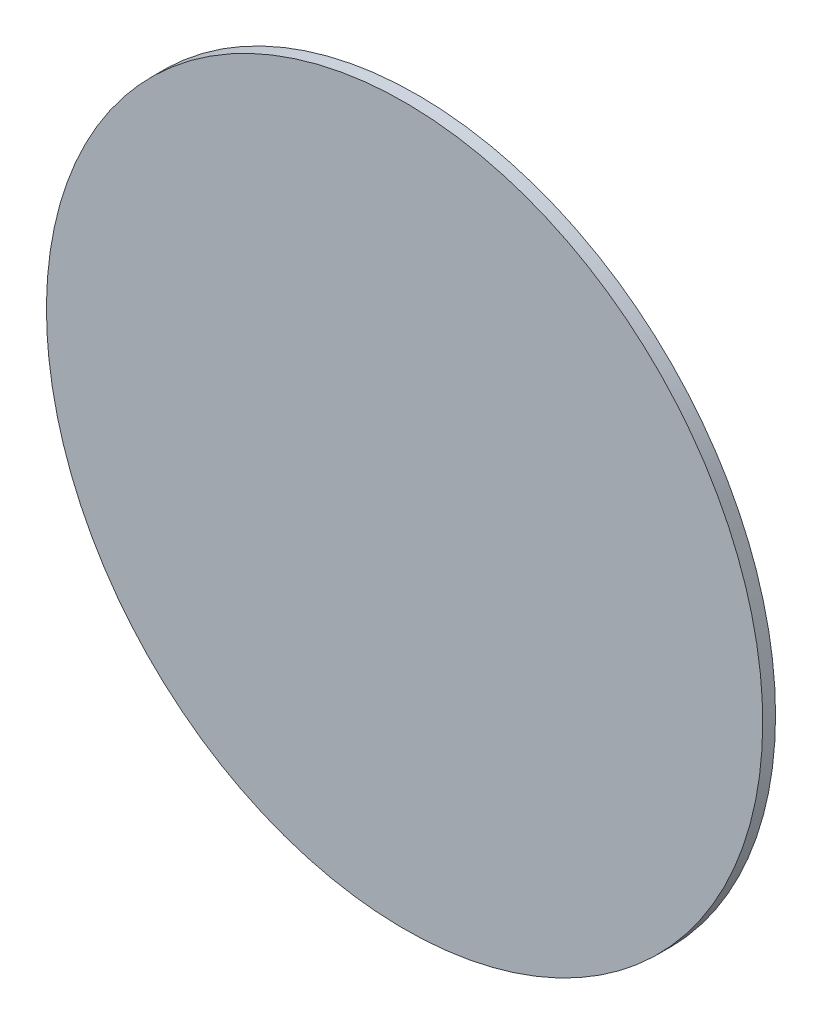
ISO-10303-21;
HEADER;
FILE_DESCRIPTION(('STEP AP214'),'2;1');
FILE_NAME('part.step','',(''),(''),'','','');
FILE_SCHEMA(('AUTOMOTIVE_DESIGN { 1 0 10303 214 1 1 1 1 }'));
ENDSEC;
DATA;
#1=APPLICATION_CONTEXT('core data for automotive mechanical design processes');
#2=APPLICATION_PROTOCOL_DEFINITION('international standard','automotive_design',2000,#1);
#3=PRODUCT_CONTEXT('',#1,'mechanical');
#4=PRODUCT('Part','Part','',(#3));
#5=PRODUCT_RELATED_PRODUCT_CATEGORY('part','',(#4));
#6=PRODUCT_DEFINITION_FORMATION('','',#4);
#7=PRODUCT_DEFINITION_CONTEXT('part definition',#1,'design');
#8=PRODUCT_DEFINITION('design','',#6,#7);
#9=PRODUCT_DEFINITION_SHAPE('','',#8);
#10=(LENGTH_UNIT() NAMED_UNIT(*) SI_UNIT(.MILLI.,.METRE.));
#11=(NAMED_UNIT(*) PLANE_ANGLE_UNIT() SI_UNIT($,.RADIAN.));
#12=(NAMED_UNIT(*) SI_UNIT($,.STERADIAN.) SOLID_ANGLE_UNIT());
#13=UNCERTAINTY_MEASURE_WITH_UNIT(LENGTH_MEASURE(1.E-05),#10,'distance_accuracy_value','');
#14=(GEOMETRIC_REPRESENTATION_CONTEXT(3) GLOBAL_UNCERTAINTY_ASSIGNED_CONTEXT((#13)) GLOBAL_UNIT_ASSIGNED_CONTEXT((#10,
#11,#12)) REPRESENTATION_CONTEXT('',''));
#15=CARTESIAN_POINT('',(0.,0.,0.));
#16=DIRECTION('',(0.,0.,1.));
#17=DIRECTION('',(1.,0.,0.));
#18=AXIS2_PLACEMENT_3D('',#15,#16,#17);
#19=CARTESIAN_POINT('',(19.1957204819851,-5.56478500104615,13.2347526985872));
#20=CARTESIAN_POINT('',(19.1957204819851,-4.65622838765004,13.2347526985872));
#21=CARTESIAN_POINT('',(19.0167504502195,-2.83911516085782,13.2347526985872));
#22=CARTESIAN_POINT('',(18.221701884204,-0.218191284054681,13.2347526985872));
#23=CARTESIAN_POINT('',(16.930613070345,2.19726599460878,13.2347526985872));
#24=CARTESIAN_POINT('',(15.1930998277081,4.31443200651757,13.2347526985872));
#25=CARTESIAN_POINT('',(13.0759338157993,6.05194524915441,13.2347526985872));
#26=CARTESIAN_POINT('',(10.6604765371359,7.34303406301343,13.2347526985872));
#27=CARTESIAN_POINT('',(8.03955266033273,8.13808262902896,13.2347526985872));
#28=CARTESIAN_POINT('',(5.31388282014441,8.40653767667741,13.2347526985872));
#29=CARTESIAN_POINT('',(2.58821297995608,8.13808262902896,13.2347526985872));
#30=CARTESIAN_POINT('',(-0.0327108968470598,7.34303406301343,13.2347526985872));
#31=CARTESIAN_POINT('',(-2.44816817551052,6.05194524915441,13.2347526985872));
#32=CARTESIAN_POINT('',(-4.56533418741931,4.31443200651757,13.2347526985872));
#33=CARTESIAN_POINT('',(-6.30284743005616,2.19726599460878,13.2347526985872));
#34=CARTESIAN_POINT('',(-7.59393624391517,-0.21819128405468,13.2347526985872));
#35=CARTESIAN_POINT('',(-8.3889848099307,-2.83911516085782,13.2347526985872));
#36=CARTESIAN_POINT('',(-8.65743985757915,-5.56478500104614,13.2347526985872));
#37=CARTESIAN_POINT('',(-8.38898480993069,-8.29045484123447,13.2347526985872));
#38=CARTESIAN_POINT('',(-7.59393624391518,-10.9113787180376,13.2347526985872));
#39=CARTESIAN_POINT('',(-6.30284743005615,-13.3268359967011,13.2347526985872));
#40=CARTESIAN_POINT('',(-4.56533418741932,-15.4440020086099,13.2347526985872));
#41=CARTESIAN_POINT('',(-2.44816817551053,-17.1815152512467,13.2347526985872));
#42=CARTESIAN_POINT('',(-0.032710896847064,-18.4726040651057,13.2347526985872));
#43=CARTESIAN_POINT('',(2.58821297995607,-19.2676526311213,13.2347526985872));
#44=CARTESIAN_POINT('',(5.31388282014441,-19.5361076787697,13.2347526985872));
#45=CARTESIAN_POINT('',(8.03955266033271,-19.2676526311212,13.2347526985872));
#46=CARTESIAN_POINT('',(10.6604765371359,-18.4726040651057,13.2347526985872));
#47=CARTESIAN_POINT('',(13.0759338157993,-17.1815152512467,13.2347526985872));
#48=CARTESIAN_POINT('',(15.1930998277081,-15.4440020086099,13.2347526985872));
#49=CARTESIAN_POINT('',(16.930613070345,-13.3268359967011,13.2347526985872));
#50=CARTESIAN_POINT('',(18.221701884204,-10.9113787180376,13.2347526985872));
#51=CARTESIAN_POINT('',(19.0167504502195,-8.29045484123448,13.2347526985872));
#52=CARTESIAN_POINT('',(19.1957204819851,-6.47334161444225,13.2347526985872));
#53=CARTESIAN_POINT('',(19.1957204819851,-5.56478500104615,13.2347526985872));
#54=B_SPLINE_CURVE_WITH_KNOTS('',3,(#19,#20,#21,#22,#23,#24,#25,#26,#27,#28,#29,#30,#31,#32,#33,
#34,#35,#36,#37,#38,#39,#40,#41,#42,#43,#44,#45,#46,#47,#48,#49,#50,#51,#52,#53),.UNSPECIFIED.,
.T.,.F.,(4,1,1,1,1,1,1,1,1,1,1,1,1,1,1,1,1,1,1,1,1,1,1,1,1,1,1,1,1,1,1,1,4),(0.,0.03125,0.0625,
0.09375,0.125,0.15625,0.1875,0.21875,0.25,0.28125,0.3125,0.34375,0.375,0.40625,0.4375,0.46875,
0.5,0.53125,0.5625,0.59375,0.625,0.65625,0.6875,0.71875,0.75,0.78125,0.8125,0.84375,0.875,
0.90625,0.9375,0.96875,1.),.UNSPECIFIED.);
#55=DIRECTION('',(0.,0.,1.));
#56=VECTOR('',#55,1.);
#57=SURFACE_OF_LINEAR_EXTRUSION('',#54,#56);
#58=CARTESIAN_POINT('',(19.1957204819851,-5.56478500104615,13.2347526985872));
#59=CARTESIAN_POINT('',(19.1957204731118,-5.3830729507092,13.2347526985872));
#60=CARTESIAN_POINT('',(19.1921410535162,-5.20136169468733,13.2347526985872));
#61=CARTESIAN_POINT('',(19.1778509706295,-4.83821850245682,13.2347526985872));
#62=CARTESIAN_POINT('',(19.1671402605445,-4.65678656808886,13.2347526985872));
#63=CARTESIAN_POINT('',(19.138615126941,-4.29448153005465,13.2347526985872));
#64=CARTESIAN_POINT('',(19.12080067941,-4.11360842827949,13.2347526985872));
#65=CARTESIAN_POINT('',(19.0780955159705,-3.7527000849403,13.2347526985872));
#66=CARTESIAN_POINT('',(19.0532048239822,-3.57266484054611,13.2347526985872));
#67=CARTESIAN_POINT('',(18.9963745612493,-3.21371123935877,13.2347526985872));
#68=CARTESIAN_POINT('',(18.9644350367591,-3.03479287524456,13.2347526985872));
#69=CARTESIAN_POINT('',(18.8935346908909,-2.67835276759949,13.2347526985872));
#70=CARTESIAN_POINT('',(18.8545738695129,-2.50083102406863,13.2347526985872));
#71=CARTESIAN_POINT('',(18.7697125916351,-2.14745314286919,13.2347526985872));
#72=CARTESIAN_POINT('',(18.7238120896002,-1.97159701613771,13.2347526985872));
#73=CARTESIAN_POINT('',(18.6251528660009,-1.6218186097477,13.2347526985872));
#74=CARTESIAN_POINT('',(18.5723941212541,-1.44789633662818,13.2347526985872));
#75=CARTESIAN_POINT('',(18.4600997968574,-1.1022540927297,13.2347526985872));
#76=CARTESIAN_POINT('',(18.4005642401159,-0.930534114508289,13.2347526985872));
#77=CARTESIAN_POINT('',(18.2747975823137,-0.589564744998639,13.2347526985872));
#78=CARTESIAN_POINT('',(18.2085665251905,-0.420315337506277,13.2347526985872));
#79=CARTESIAN_POINT('',(18.0694904939363,-0.0845560966496612,13.2347526985872));
#80=CARTESIAN_POINT('',(17.9966455198053,0.0819537367145932,13.2347526985872));
#81=CARTESIAN_POINT('',(17.8444742230227,0.411985946655101,13.2347526985872));
#82=CARTESIAN_POINT('',(17.7651478578446,0.57550830362094,13.2347526985872));
#83=CARTESIAN_POINT('',(17.600145961606,0.899318356398301,13.2347526985872));
#84=CARTESIAN_POINT('',(17.5144704090842,1.0596060412738,13.2347526985872));
#85=CARTESIAN_POINT('',(17.3369023319838,1.376699330444,13.2347526985872));
#86=CARTESIAN_POINT('',(17.2450098284214,1.53350494650733,13.2347526985872));
#87=CARTESIAN_POINT('',(17.0551399175868,1.84338682742763,13.2347526985872));
#88=CARTESIAN_POINT('',(16.9571625502466,1.99646311674914,13.2347526985872));
#89=CARTESIAN_POINT('',(16.7552554475174,2.29863845021685,13.2347526985872));
#90=CARTESIAN_POINT('',(16.6513257121283,2.44773749436305,13.2347526985872));
#91=CARTESIAN_POINT('',(16.4376922540309,2.74174108064118,13.2347526985872));
#92=CARTESIAN_POINT('',(16.3279884934391,2.88664559524299,13.2347526985872));
#93=CARTESIAN_POINT('',(16.1029848549013,3.17204345558304,13.2347526985872));
#94=CARTESIAN_POINT('',(15.98768495804,3.31253678640851,13.2347526985872));
#95=CARTESIAN_POINT('',(15.751666969857,3.58889540360001,13.2347526985872));
#96=CARTESIAN_POINT('',(15.6309488968518,3.72476070560861,13.2347526985872));
#97=CARTESIAN_POINT('',(15.3842723271781,3.99164651103301,13.2347526985872));
#98=CARTESIAN_POINT('',(15.2583138649014,4.1226670462336,13.2347526985872));
#99=CARTESIAN_POINT('',(15.0013348674242,4.37964604371088,13.2347526985872));
#100=CARTESIAN_POINT('',(14.8703143322236,4.50560450598756,13.2347526985872));
#101=CARTESIAN_POINT('',(14.6034285267992,4.75228107566128,13.2347526985872));
#102=CARTESIAN_POINT('',(14.4675632247906,4.87299914866647,13.2347526985872));
#103=CARTESIAN_POINT('',(14.1912046075991,5.10901713684942,13.2347526985872));
#104=CARTESIAN_POINT('',(14.0507112767736,5.22431703371076,13.2347526985872));
#105=CARTESIAN_POINT('',(13.7653134164336,5.44932067224857,13.2347526985872));
#106=CARTESIAN_POINT('',(13.6204089018317,5.55902443284039,13.2347526985872));
#107=CARTESIAN_POINT('',(13.3264053155536,5.77265789093772,13.2347526985872));
#108=CARTESIAN_POINT('',(13.1773062714074,5.87658762632681,13.2347526985872));
#109=CARTESIAN_POINT('',(12.8751309379397,6.07849472905607,13.2347526985872));
#110=CARTESIAN_POINT('',(12.7220546486182,6.17647209639626,13.2347526985872));
#111=CARTESIAN_POINT('',(12.4121727676979,6.36634200723082,13.2347526985872));
#112=CARTESIAN_POINT('',(12.2553671516346,6.45823451079328,13.2347526985872));
#113=CARTESIAN_POINT('',(11.9382738624643,6.63580258789368,13.2347526985872));
#114=CARTESIAN_POINT('',(11.7779861775888,6.72147814041543,13.2347526985872));
#115=CARTESIAN_POINT('',(11.4541761248116,6.88648003665403,13.2347526985872));
#116=CARTESIAN_POINT('',(11.2906537678459,6.96580640183211,13.2347526985872));
#117=CARTESIAN_POINT('',(10.9606215579049,7.11797769861472,13.2347526985872));
#118=CARTESIAN_POINT('',(10.79411172454,7.19082267274576,13.2347526985872));
#119=CARTESIAN_POINT('',(10.4583524836852,7.32989870399994,13.2347526985872));
#120=CARTESIAN_POINT('',(10.2891030761952,7.39612976112308,13.2347526985872));
#121=CARTESIAN_POINT('',(9.94813370667901,7.5218964189254,13.2347526985872));
#122=CARTESIAN_POINT('',(9.77641372844868,7.58143197566713,13.2347526985872));
#123=CARTESIAN_POINT('',(9.43077148457457,7.69372630006333,13.2347526985872));
#124=CARTESIAN_POINT('',(9.25684921148834,7.74648504480949,13.2347526985872));
#125=CARTESIAN_POINT('',(8.90707080500738,7.84514426841056,13.2347526985872));
#126=CARTESIAN_POINT('',(8.73121467815165,7.89104477044784,13.2347526985872));
#127=CARTESIAN_POINT('',(8.37783679729166,7.97590604831901,13.2347526985872));
#128=CARTESIAN_POINT('',(8.2003150542245,8.01486686968808,13.2347526985872));
#129=CARTESIAN_POINT('',(7.84387494531258,8.08576721558081,13.2347526985872));
#130=CARTESIAN_POINT('',(7.66495657946782,8.11770674010448,13.2347526985872));
#131=CARTESIAN_POINT('',(7.30600298300844,8.17453700274595,13.2347526985872));
#132=CARTESIAN_POINT('',(7.12596774507281,8.1994276946093,13.2347526985872));
#133=CARTESIAN_POINT('',(6.7650593840885,8.24213285839014,13.2347526985872));
#134=CARTESIAN_POINT('',(6.58418625820956,8.25994730638756,13.2347526985872));
#135=CARTESIAN_POINT('',(6.22188128602794,8.28847243871683,13.2347526985872));
#136=CARTESIAN_POINT('',(6.04044944161596,8.29918314706133,13.2347526985872));
#137=CARTESIAN_POINT('',(5.67730600362181,8.31347323470323,13.2347526985872));
#138=CARTESIAN_POINT('',(5.49559441188311,8.31705266079459,13.2347526985872));
#139=CARTESIAN_POINT('',(5.13217122840571,8.31705266079459,13.2347526985872));
#140=CARTESIAN_POINT('',(4.95045963666701,8.31347323470323,13.2347526985872));
#141=CARTESIAN_POINT('',(4.58731619867285,8.29918314706132,13.2347526985872));
#142=CARTESIAN_POINT('',(4.40588435426088,8.28847243871683,13.2347526985872));
#143=CARTESIAN_POINT('',(4.04357938207925,8.25994730638755,13.2347526985872));
#144=CARTESIAN_POINT('',(3.86270625620032,8.24213285839014,13.2347526985872));
#145=CARTESIAN_POINT('',(3.50179789521601,8.19942769460929,13.2347526985872));
#146=CARTESIAN_POINT('',(3.32176265728038,8.17453700274595,13.2347526985872));
#147=CARTESIAN_POINT('',(2.962809060821,8.11770674010448,13.2347526985872));
#148=CARTESIAN_POINT('',(2.78389069497624,8.08576721558081,13.2347526985872));
#149=CARTESIAN_POINT('',(2.42745058606432,8.01486686968808,13.2347526985872));
#150=CARTESIAN_POINT('',(2.24992884299716,7.97590604831901,13.2347526985872));
#151=CARTESIAN_POINT('',(1.89655096213717,7.89104477044784,13.2347526985872));
#152=CARTESIAN_POINT('',(1.72069483528144,7.84514426841055,13.2347526985872));
#153=CARTESIAN_POINT('',(1.37091642880047,7.74648504480949,13.2347526985872));
#154=CARTESIAN_POINT('',(1.19699415571424,7.69372630006333,13.2347526985872));
#155=CARTESIAN_POINT('',(0.851351911840135,7.58143197566713,13.2347526985872));
#156=CARTESIAN_POINT('',(0.679631933609804,7.5218964189254,13.2347526985872));
#157=CARTESIAN_POINT('',(0.338662564093624,7.39612976112308,13.2347526985872));
#158=CARTESIAN_POINT('',(0.169413156603653,7.32989870399994,13.2347526985872));
#159=CARTESIAN_POINT('',(-0.166346084251214,7.19082267274576,13.2347526985872));
#160=CARTESIAN_POINT('',(-0.332855917616108,7.11797769861472,13.2347526985872));
#161=CARTESIAN_POINT('',(-0.662888127557085,6.96580640183212,13.2347526985872));
#162=CARTESIAN_POINT('',(-0.826410484522752,6.88648003665404,13.2347526985872));
#163=CARTESIAN_POINT('',(-1.15022053729998,6.72147814041544,13.2347526985872));
#164=CARTESIAN_POINT('',(-1.31050822217552,6.63580258789369,13.2347526985872));
#165=CARTESIAN_POINT('',(-1.62760151134575,6.45823451079329,13.2347526985872));
#166=CARTESIAN_POINT('',(-1.78440712740908,6.36634200723083,13.2347526985872));
#167=CARTESIAN_POINT('',(-2.09428900832938,6.17647209639626,13.2347526985872));
#168=CARTESIAN_POINT('',(-2.24736529765089,6.07849472905607,13.2347526985872));
#169=CARTESIAN_POINT('',(-2.5495406311186,5.87658762632681,13.2347526985872));
#170=CARTESIAN_POINT('',(-2.6986396752648,5.77265789093773,13.2347526985872));
#171=CARTESIAN_POINT('',(-2.99264326154293,5.55902443284039,13.2347526985872));
#172=CARTESIAN_POINT('',(-3.13754777614474,5.44932067224857,13.2347526985872));
#173=CARTESIAN_POINT('',(-3.42294563648478,5.22431703371076,13.2347526985872));
#174=CARTESIAN_POINT('',(-3.56343896731025,5.10901713684943,13.2347526985872));
#175=CARTESIAN_POINT('',(-3.83979758450176,4.87299914866647,13.2347526985872));
#176=CARTESIAN_POINT('',(-3.97566288651035,4.75228107566128,13.2347526985872));
#177=CARTESIAN_POINT('',(-4.24254869193475,4.50560450598756,13.2347526985872));
#178=CARTESIAN_POINT('',(-4.37356922713535,4.37964604371088,13.2347526985872));
#179=CARTESIAN_POINT('',(-4.63054822461262,4.12266704623361,13.2347526985872));
#180=CARTESIAN_POINT('',(-4.7565066868893,3.99164651103302,13.2347526985872));
#181=CARTESIAN_POINT('',(-5.00318325656302,3.72476070560861,13.2347526985872));
#182=CARTESIAN_POINT('',(-5.12390132956821,3.58889540360002,13.2347526985872));
#183=CARTESIAN_POINT('',(-5.35991931775117,3.31253678640851,13.2347526985872));
#184=CARTESIAN_POINT('',(-5.47521921461251,3.17204345558304,13.2347526985872));
#185=CARTESIAN_POINT('',(-5.70022285315032,2.886645595243,13.2347526985872));
#186=CARTESIAN_POINT('',(-5.80992661374214,2.74174108064119,13.2347526985872));
#187=CARTESIAN_POINT('',(-6.02356007183947,2.44773749436306,13.2347526985872));
#188=CARTESIAN_POINT('',(-6.12748980722855,2.29863845021686,13.2347526985872));
#189=CARTESIAN_POINT('',(-6.32939690995782,1.99646311674914,13.2347526985872));
#190=CARTESIAN_POINT('',(-6.427374277298,1.84338682742763,13.2347526985872));
#191=CARTESIAN_POINT('',(-6.61724418813258,1.53350494650734,13.2347526985872));
#192=CARTESIAN_POINT('',(-6.70913669169504,1.37669933044401,13.2347526985872));
#193=CARTESIAN_POINT('',(-6.88670476879544,1.05960604127378,13.2347526985872));
#194=CARTESIAN_POINT('',(-6.97238032131718,0.899318356398238,13.2347526985872));
#195=CARTESIAN_POINT('',(-7.13738221755578,0.575508303621007,13.2347526985872));
#196=CARTESIAN_POINT('',(-7.21670858273386,0.411985946655341,13.2347526985872));
#197=CARTESIAN_POINT('',(-7.36887987951647,0.0819537367143638,13.2347526985872));
#198=CARTESIAN_POINT('',(-7.4417248536475,-0.0845560966505311,13.2347526985872));
#199=CARTESIAN_POINT('',(-7.58080088490168,-0.420315337505398,13.2347526985872));
#200=CARTESIAN_POINT('',(-7.64703194202483,-0.58956474499537,13.2347526985872));
#201=CARTESIAN_POINT('',(-7.77279859982714,-0.93053411451155,13.2347526985872));
#202=CARTESIAN_POINT('',(-7.83233415656887,-1.10225409274188,13.2347526985872));
#203=CARTESIAN_POINT('',(-7.94462848096508,-1.44789633661599,13.2347526985872));
#204=CARTESIAN_POINT('',(-7.99738722571123,-1.62181860970222,13.2347526985872));
#205=CARTESIAN_POINT('',(-8.0960464493123,-1.97159701618318,13.2347526985872));
#206=CARTESIAN_POINT('',(-8.14194695134958,-2.14745314303891,13.2347526985872));
#207=CARTESIAN_POINT('',(-8.22680822922076,-2.5008310238989,13.2347526985872));
#208=CARTESIAN_POINT('',(-8.26576905058982,-2.67835276696607,13.2347526985872));
#209=CARTESIAN_POINT('',(-8.33666939648255,-3.03479287587798,13.2347526985872));
#210=CARTESIAN_POINT('',(-8.36860892100622,-3.21371124172274,13.2347526985872));
#211=CARTESIAN_POINT('',(-8.42543918364769,-3.57266483818212,13.2347526985872));
#212=CARTESIAN_POINT('',(-8.45032987551104,-3.75270007611775,13.2347526985872));
#213=CARTESIAN_POINT('',(-8.49303503929188,-4.11360843710206,13.2347526985872));
#214=CARTESIAN_POINT('',(-8.5108494872893,-4.294481562981,13.2347526985872));
#215=CARTESIAN_POINT('',(-8.53937461961857,-4.65678653516262,13.2347526985872));
#216=CARTESIAN_POINT('',(-8.55008532796307,-4.8382183795746,13.2347526985872));
#217=CARTESIAN_POINT('',(-8.56437541560497,-5.20136181756874,13.2347526985872));
#218=CARTESIAN_POINT('',(-8.56795484169633,-5.38307340930744,13.2347526985872));
#219=CARTESIAN_POINT('',(-8.56795484169633,-5.74649659278483,13.2347526985872));
#220=CARTESIAN_POINT('',(-8.56437541560497,-5.92820818452353,13.2347526985872));
#221=CARTESIAN_POINT('',(-8.55008532796307,-6.29135162251769,13.2347526985872));
#222=CARTESIAN_POINT('',(-8.53937461961857,-6.47278346692967,13.2347526985872));
#223=CARTESIAN_POINT('',(-8.51084948728929,-6.83508843911129,13.2347526985872));
#224=CARTESIAN_POINT('',(-8.49303503929188,-7.01596156499023,13.2347526985872));
#225=CARTESIAN_POINT('',(-8.45032987551103,-7.37686992597454,13.2347526985872));
#226=CARTESIAN_POINT('',(-8.42543918364769,-7.55690516391016,13.2347526985872));
#227=CARTESIAN_POINT('',(-8.36860892100622,-7.91585876036955,13.2347526985872));
#228=CARTESIAN_POINT('',(-8.33666939648255,-8.0947771262143,13.2347526985872));
#229=CARTESIAN_POINT('',(-8.26576905058982,-8.45121723512622,13.2347526985872));
#230=CARTESIAN_POINT('',(-8.22680822922076,-8.62873897819339,13.2347526985872));
#231=CARTESIAN_POINT('',(-8.14194695134958,-8.98211685905338,13.2347526985872));
#232=CARTESIAN_POINT('',(-8.0960464493123,-9.15797298590912,13.2347526985872));
#233=CARTESIAN_POINT('',(-7.99738722571123,-9.50775139239008,13.2347526985872));
#234=CARTESIAN_POINT('',(-7.94462848096507,-9.68167366547631,13.2347526985872));
#235=CARTESIAN_POINT('',(-7.83233415656887,-10.0273159093504,13.2347526985872));
#236=CARTESIAN_POINT('',(-7.77279859982714,-10.1990358875807,13.2347526985872));
#237=CARTESIAN_POINT('',(-7.64703194202483,-10.5400052570969,13.2347526985872));
#238=CARTESIAN_POINT('',(-7.58080088490168,-10.7092546645869,13.2347526985872));
#239=CARTESIAN_POINT('',(-7.4417248536475,-11.0450139054418,13.2347526985872));
#240=CARTESIAN_POINT('',(-7.36887987951647,-11.2115237388067,13.2347526985872));
#241=CARTESIAN_POINT('',(-7.21670858273386,-11.5415559487476,13.2347526985872));
#242=CARTESIAN_POINT('',(-7.13738221755578,-11.7050783057133,13.2347526985872));
#243=CARTESIAN_POINT('',(-6.97238032131718,-12.0288883584905,13.2347526985872));
#244=CARTESIAN_POINT('',(-6.88670476879544,-12.1891760433661,13.2347526985872));
#245=CARTESIAN_POINT('',(-6.70913669169504,-12.5062693325363,13.2347526985872));
#246=CARTESIAN_POINT('',(-6.61724418813257,-12.6630749485996,13.2347526985872));
#247=CARTESIAN_POINT('',(-6.427374277298,-12.9729568295199,13.2347526985872));
#248=CARTESIAN_POINT('',(-6.32939690995782,-13.1260331188414,13.2347526985872));
#249=CARTESIAN_POINT('',(-6.12748980722855,-13.4282084523091,13.2347526985872));
#250=CARTESIAN_POINT('',(-6.02356007183947,-13.5773074964553,13.2347526985872));
#251=CARTESIAN_POINT('',(-5.80992661374214,-13.8713110827335,13.2347526985872));
#252=CARTESIAN_POINT('',(-5.70022285315032,-14.0162155973353,13.2347526985872));
#253=CARTESIAN_POINT('',(-5.47521921461251,-14.3016134576753,13.2347526985872));
#254=CARTESIAN_POINT('',(-5.35991931775117,-14.4421067885008,13.2347526985872));
#255=CARTESIAN_POINT('',(-5.12390132956822,-14.7184654056923,13.2347526985872));
#256=CARTESIAN_POINT('',(-5.00318325656303,-14.8543307077009,13.2347526985872));
#257=CARTESIAN_POINT('',(-4.75650668688931,-15.1212165131253,13.2347526985872));
#258=CARTESIAN_POINT('',(-4.63054822461263,-15.2522370483259,13.2347526985872));
#259=CARTESIAN_POINT('',(-4.37356922713536,-15.5092160458032,13.2347526985872));
#260=CARTESIAN_POINT('',(-4.24254869193476,-15.6351745080798,13.2347526985872));
#261=CARTESIAN_POINT('',(-3.97566288651036,-15.8818510777536,13.2347526985872));
#262=CARTESIAN_POINT('',(-3.83979758450177,-16.0025691507588,13.2347526985872));
#263=CARTESIAN_POINT('',(-3.56343896731027,-16.2385871389417,13.2347526985872));
#264=CARTESIAN_POINT('',(-3.4229456364848,-16.353887035803,13.2347526985872));
#265=CARTESIAN_POINT('',(-3.13754777614476,-16.5788906743409,13.2347526985872));
#266=CARTESIAN_POINT('',(-2.99264326154295,-16.6885944349327,13.2347526985872));
#267=CARTESIAN_POINT('',(-2.69863967526481,-16.90222789303,13.2347526985872));
#268=CARTESIAN_POINT('',(-2.54954063111861,-17.0061576284191,13.2347526985872));
#269=CARTESIAN_POINT('',(-2.2473652976509,-17.2080647311484,13.2347526985872));
#270=CARTESIAN_POINT('',(-2.0942890083294,-17.3060420984885,13.2347526985872));
#271=CARTESIAN_POINT('',(-1.7844071274091,-17.4959120093231,13.2347526985872));
#272=CARTESIAN_POINT('',(-1.62760151134578,-17.5878045128856,13.2347526985872));
#273=CARTESIAN_POINT('',(-1.31050822217555,-17.765372589986,13.2347526985872));
#274=CARTESIAN_POINT('',(-1.15022053730001,-17.8510481425077,13.2347526985872));
#275=CARTESIAN_POINT('',(-0.826410484522771,-18.0160500387463,13.2347526985872));
#276=CARTESIAN_POINT('',(-0.662888127557098,-18.0953764039244,13.2347526985872));
#277=CARTESIAN_POINT('',(-0.332855917616116,-18.247547700707,13.2347526985872));
#278=CARTESIAN_POINT('',(-0.166346084251221,-18.320392674838,13.2347526985872));
#279=CARTESIAN_POINT('',(0.169413156603646,-18.4594687060922,13.2347526985872));
#280=CARTESIAN_POINT('',(0.338662564093617,-18.5256997632154,13.2347526985872));
#281=CARTESIAN_POINT('',(0.679631933609797,-18.6514664210177,13.2347526985872));
#282=CARTESIAN_POINT('',(0.851351911840129,-18.7110019777594,13.2347526985872));
#283=CARTESIAN_POINT('',(1.19699415571423,-18.8232963021556,13.2347526985872));
#284=CARTESIAN_POINT('',(1.37091642880045,-18.8760550469018,13.2347526985872));
#285=CARTESIAN_POINT('',(1.72069483528142,-18.9747142705028,13.2347526985872));
#286=CARTESIAN_POINT('',(1.89655096213715,-19.0206147725401,13.2347526985872));
#287=CARTESIAN_POINT('',(2.24992884299715,-19.1054760504113,13.2347526985872));
#288=CARTESIAN_POINT('',(2.42745058606431,-19.1444368717804,13.2347526985872));
#289=CARTESIAN_POINT('',(2.78389069497623,-19.2153372176731,13.2347526985872));
#290=CARTESIAN_POINT('',(2.96280906082099,-19.2472767421968,13.2347526985872));
#291=CARTESIAN_POINT('',(3.32176265728037,-19.3041070048382,13.2347526985872));
#292=CARTESIAN_POINT('',(3.501797895216,-19.3289976967016,13.2347526985872));
#293=CARTESIAN_POINT('',(3.86270625620031,-19.3717028604824,13.2347526985872));
#294=CARTESIAN_POINT('',(4.04357938207925,-19.3895173084798,13.2347526985872));
#295=CARTESIAN_POINT('',(4.40588435426087,-19.4180424408091,13.2347526985872));
#296=CARTESIAN_POINT('',(4.58731619867285,-19.4287531491536,13.2347526985872));
#297=CARTESIAN_POINT('',(4.950459636667,-19.4430432367955,13.2347526985872));
#298=CARTESIAN_POINT('',(5.1321712284057,-19.4466226628869,13.2347526985872));
#299=CARTESIAN_POINT('',(5.4955944118831,-19.4466226628869,13.2347526985872));
#300=CARTESIAN_POINT('',(5.6773060036218,-19.4430432367955,13.2347526985872));
#301=CARTESIAN_POINT('',(6.04044944161595,-19.4287531491536,13.2347526985872));
#302=CARTESIAN_POINT('',(6.22188128602793,-19.4180424408091,13.2347526985872));
#303=CARTESIAN_POINT('',(6.58418625820955,-19.3895173084798,13.2347526985872));
#304=CARTESIAN_POINT('',(6.76505938408849,-19.3717028604824,13.2347526985872));
#305=CARTESIAN_POINT('',(7.1259677450728,-19.3289976967016,13.2347526985872));
#306=CARTESIAN_POINT('',(7.30600298300842,-19.3041070048382,13.2347526985872));
#307=CARTESIAN_POINT('',(7.66495657946781,-19.2472767421968,13.2347526985872));
#308=CARTESIAN_POINT('',(7.84387494531256,-19.2153372176731,13.2347526985872));
#309=CARTESIAN_POINT('',(8.20031505422448,-19.1444368717804,13.2347526985872));
#310=CARTESIAN_POINT('',(8.37783679729165,-19.1054760504113,13.2347526985872));
#311=CARTESIAN_POINT('',(8.73121467815164,-19.0206147725401,13.2347526985872));
#312=CARTESIAN_POINT('',(8.90707080500738,-18.9747142705028,13.2347526985872));
#313=CARTESIAN_POINT('',(9.25684921148835,-18.8760550469018,13.2347526985872));
#314=CARTESIAN_POINT('',(9.43077148457457,-18.8232963021556,13.2347526985872));
#315=CARTESIAN_POINT('',(9.77641372844867,-18.7110019777594,13.2347526985872));
#316=CARTESIAN_POINT('',(9.94813370667901,-18.6514664210177,13.2347526985872));
#317=CARTESIAN_POINT('',(10.2891030761952,-18.5256997632154,13.2347526985872));
#318=CARTESIAN_POINT('',(10.4583524836852,-18.4594687060922,13.2347526985872));
#319=CARTESIAN_POINT('',(10.79411172454,-18.320392674838,13.2347526985872));
#320=CARTESIAN_POINT('',(10.9606215579049,-18.247547700707,13.2347526985872));
#321=CARTESIAN_POINT('',(11.2906537678459,-18.0953764039244,13.2347526985872));
#322=CARTESIAN_POINT('',(11.4541761248116,-18.0160500387463,13.2347526985872));
#323=CARTESIAN_POINT('',(11.7779861775888,-17.8510481425077,13.2347526985872));
#324=CARTESIAN_POINT('',(11.9382738624643,-17.765372589986,13.2347526985872));
#325=CARTESIAN_POINT('',(12.2553671516346,-17.5878045128856,13.2347526985872));
#326=CARTESIAN_POINT('',(12.4121727676979,-17.4959120093231,13.2347526985872));
#327=CARTESIAN_POINT('',(12.7220546486182,-17.3060420984886,13.2347526985872));
#328=CARTESIAN_POINT('',(12.8751309379397,-17.2080647311484,13.2347526985872));
#329=CARTESIAN_POINT('',(13.1773062714074,-17.0061576284191,13.2347526985872));
#330=CARTESIAN_POINT('',(13.3264053155536,-16.90222789303,13.2347526985872));
#331=CARTESIAN_POINT('',(13.6204089018317,-16.6885944349327,13.2347526985872));
#332=CARTESIAN_POINT('',(13.7653134164336,-16.5788906743409,13.2347526985872));
#333=CARTESIAN_POINT('',(14.0507112767736,-16.3538870358031,13.2347526985872));
#334=CARTESIAN_POINT('',(14.1912046075991,-16.2385871389417,13.2347526985872));
#335=CARTESIAN_POINT('',(14.4675632247906,-16.0025691507588,13.2347526985872));
#336=CARTESIAN_POINT('',(14.6034285267992,-15.8818510777536,13.2347526985872));
#337=CARTESIAN_POINT('',(14.8703143322236,-15.6351745080799,13.2347526985872));
#338=CARTESIAN_POINT('',(15.0013348674242,-15.5092160458032,13.2347526985872));
#339=CARTESIAN_POINT('',(15.2583138649014,-15.2522370483259,13.2347526985872));
#340=CARTESIAN_POINT('',(15.3842723271781,-15.1212165131253,13.2347526985872));
#341=CARTESIAN_POINT('',(15.6309488968518,-14.8543307077009,13.2347526985872));
#342=CARTESIAN_POINT('',(15.751666969857,-14.7184654056923,13.2347526985872));
#343=CARTESIAN_POINT('',(15.98768495804,-14.4421067885008,13.2347526985872));
#344=CARTESIAN_POINT('',(16.1029848549013,-14.3016134576753,13.2347526985872));
#345=CARTESIAN_POINT('',(16.3279884934391,-14.0162155973353,13.2347526985872));
#346=CARTESIAN_POINT('',(16.4376922540309,-13.8713110827335,13.2347526985872));
#347=CARTESIAN_POINT('',(16.6513257121283,-13.5773074964554,13.2347526985872));
#348=CARTESIAN_POINT('',(16.7552554475173,-13.4282084523092,13.2347526985872));
#349=CARTESIAN_POINT('',(16.9571625502466,-13.1260331188414,13.2347526985872));
#350=CARTESIAN_POINT('',(17.0551399175868,-12.9729568295199,13.2347526985872));
#351=CARTESIAN_POINT('',(17.2450098284214,-12.6630749485996,13.2347526985872));
#352=CARTESIAN_POINT('',(17.3369023319838,-12.5062693325363,13.2347526985872));
#353=CARTESIAN_POINT('',(17.5144704090842,-12.1891760433661,13.2347526985872));
#354=CARTESIAN_POINT('',(17.600145961606,-12.0288883584906,13.2347526985872));
#355=CARTESIAN_POINT('',(17.7651478578446,-11.7050783057133,13.2347526985872));
#356=CARTESIAN_POINT('',(17.8444742230227,-11.5415559487474,13.2347526985872));
#357=CARTESIAN_POINT('',(17.9966455198053,-11.2115237388069,13.2347526985872));
#358=CARTESIAN_POINT('',(18.0694904939363,-11.0450139054427,13.2347526985872));
#359=CARTESIAN_POINT('',(18.2085665251905,-10.709254664586,13.2347526985872));
#360=CARTESIAN_POINT('',(18.2747975823137,-10.5400052570937,13.2347526985872));
#361=CARTESIAN_POINT('',(18.4005642401159,-10.199035887584,13.2347526985872));
#362=CARTESIAN_POINT('',(18.4600997968574,-10.0273159093626,13.2347526985872));
#363=CARTESIAN_POINT('',(18.5723941212541,-9.68167366546415,13.2347526985872));
#364=CARTESIAN_POINT('',(18.6251528660009,-9.50775139234464,13.2347526985872));
#365=CARTESIAN_POINT('',(18.7238120896002,-9.15797298595463,13.2347526985872));
#366=CARTESIAN_POINT('',(18.7697125916351,-8.98211685922314,13.2347526985872));
#367=CARTESIAN_POINT('',(18.8545738695128,-8.62873897802369,13.2347526985872));
#368=CARTESIAN_POINT('',(18.8935346908909,-8.45121723449283,13.2347526985872));
#369=CARTESIAN_POINT('',(18.9644350367591,-8.09477712684776,13.2347526985872));
#370=CARTESIAN_POINT('',(18.9963745612493,-7.91585876273355,13.2347526985872));
#371=CARTESIAN_POINT('',(19.0532048239822,-7.55690516154621,13.2347526985872));
#372=CARTESIAN_POINT('',(19.0780955159705,-7.37686991715203,13.2347526985872));
#373=CARTESIAN_POINT('',(19.12080067941,-7.01596157381283,13.2347526985872));
#374=CARTESIAN_POINT('',(19.138615126941,-6.83508847203767,13.2347526985872));
#375=CARTESIAN_POINT('',(19.1671402605445,-6.47278343400346,13.2347526985872));
#376=CARTESIAN_POINT('',(19.1778509706295,-6.29135149963549,13.2347526985872));
#377=CARTESIAN_POINT('',(19.1921410535161,-5.92820830740498,13.2347526985872));
#378=CARTESIAN_POINT('',(19.1957204731117,-5.74649705138312,13.2347526985872));
#379=CARTESIAN_POINT('',(19.1957204819851,-5.56478500104616,13.2347526985872));
#380=B_SPLINE_CURVE_WITH_KNOTS('',3,(#58,#59,#60,#61,#62,#63,#64,#65,#66,#67,#68,#69,#70,#71,
#72,#73,#74,#75,#76,#77,#78,#79,#80,#81,#82,#83,#84,#85,#86,#87,#88,#89,#90,#91,#92,#93,#94,#95,
#96,#97,#98,#99,#100,#101,#102,#103,#104,#105,#106,#107,#108,#109,#110,#111,#112,#113,#114,#115,
#116,#117,#118,#119,#120,#121,#122,#123,#124,#125,#126,#127,#128,#129,#130,#131,#132,#133,#134,
#135,#136,#137,#138,#139,#140,#141,#142,#143,#144,#145,#146,#147,#148,#149,#150,#151,#152,#153,
#154,#155,#156,#157,#158,#159,#160,#161,#162,#163,#164,#165,#166,#167,#168,#169,#170,#171,#172,
#173,#174,#175,#176,#177,#178,#179,#180,#181,#182,#183,#184,#185,#186,#187,#188,#189,#190,#191,
#192,#193,#194,#195,#196,#197,#198,#199,#200,#201,#202,#203,#204,#205,#206,#207,#208,#209,#210,
#211,#212,#213,#214,#215,#216,#217,#218,#219,#220,#221,#222,#223,#224,#225,#226,#227,#228,#229,
#230,#231,#232,#233,#234,#235,#236,#237,#238,#239,#240,#241,#242,#243,#244,#245,#246,#247,#248,
#249,#250,#251,#252,#253,#254,#255,#256,#257,#258,#259,#260,#261,#262,#263,#264,#265,#266,#267,
#268,#269,#270,#271,#272,#273,#274,#275,#276,#277,#278,#279,#280,#281,#282,#283,#284,#285,#286,
#287,#288,#289,#290,#291,#292,#293,#294,#295,#296,#297,#298,#299,#300,#301,#302,#303,#304,#305,
#306,#307,#308,#309,#310,#311,#312,#313,#314,#315,#316,#317,#318,#319,#320,#321,#322,#323,#324,
#325,#326,#327,#328,#329,#330,#331,#332,#333,#334,#335,#336,#337,#338,#339,#340,#341,#342,#343,
#344,#345,#346,#347,#348,#349,#350,#351,#352,#353,#354,#355,#356,#357,#358,#359,#360,#361,#362,
#363,#364,#365,#366,#367,#368,#369,#370,#371,#372,#373,#374,#375,#376,#377,#378,#379),
.UNSPECIFIED.,.F.,.F.,(4,2,2,2,2,2,2,2,2,2,2,2,2,2,2,2,2,2,2,2,2,2,2,2,2,2,2,2,2,2,2,2,2,2,2,2,
2,2,2,2,2,2,2,2,2,2,2,2,2,2,2,2,2,2,2,2,2,2,2,2,2,2,2,2,2,2,2,2,2,2,2,2,2,2,2,2,2,2,2,2,2,2,2,2,
2,2,2,2,2,2,2,2,2,2,2,2,2,2,2,2,2,2,2,2,2,2,2,2,2,2,2,2,2,2,2,2,2,2,2,2,2,2,2,2,2,2,2,2,2,2,2,2,
2,2,2,2,2,2,2,2,2,2,2,2,2,2,2,2,2,2,2,2,2,2,2,2,2,2,2,2,4),(0.,0.545099814846274,
1.09020320655626,1.63530844088388,2.18041183259387,2.72551164744014,3.27061146228642,
3.81571485399641,4.36082008832403,4.90592348003401,5.45102329488029,5.99612310972657,
6.54122650143655,7.08633173576417,7.63143512747416,8.17653494232044,8.72163475716671,
9.2667381488767,9.81184338320432,10.3569467749143,10.9020465897606,11.4471464046069,
11.9922497963169,12.5373550306445,13.0824584223545,13.6275582372007,14.172658052047,
14.717761443757,15.2628666780846,15.8079700697946,16.3530698846409,16.8981696994872,
17.4432730911971,17.9883783255248,18.5334817172347,19.078581532081,19.6236813469273,
20.1687847386373,20.7138899729649,21.2589933646749,21.8040931795212,22.3491929943674,
22.8942963860774,23.4394016204051,23.984505012115,24.5296048269613,25.0747046418076,
25.6198080335176,26.1649132678452,26.7100166595552,27.2551164744015,27.8002162892478,
28.3453196809577,28.8904249152853,29.4355283069953,29.9806281218416,30.5257279366879,
31.0708313283979,31.6159365627255,32.1610399544355,32.7061397692818,33.251239584128,
33.796342975838,34.3414482101657,34.8865516018756,35.4316514167219,35.9767512315682,
36.5218546232782,37.0669598576058,37.6120632493158,38.1571630641621,38.7022628790083,
39.2473662707183,39.7924715050459,40.3375748967559,40.8826747116022,41.4277745264485,
41.9728779181585,42.5179831524861,43.0630865441961,43.6081863590423,44.1532861738886,
44.6983895655986,45.2434947999262,45.7885981916362,46.3336980064825,46.8787978213288,
47.4239012130388,47.9690064473664,48.5141098390764,49.0592096539226,49.6043094687689,
50.1494128604789,50.6945180948065,51.2396214865165,51.7847213013628,52.3298211162091,
52.874924507919,53.4200297422467,53.9651331339566,54.5102329488029,55.0553327636492,
55.6004361553592,56.1455413896868,56.6906447813968,57.2357445962431,57.7808444110893,
58.3259478027993,58.8710530371269,59.4161564288369,59.9612562436832,60.5063560585295,
61.0514594502395,61.5965646845671,62.1416680762771,62.6867678911234,63.2318677059696,
63.7769710976796,64.3220763320072,64.8671797237172,65.4122795385635,65.9573793534098,
66.5024827451198,67.0475879794474,67.5926913711574,68.1377911860037,68.6828910008499,
69.22799439256,69.7730996268876,70.3182030185976,70.8633028334438,71.4084026482901,
71.9535060400001,72.4986112743277,73.0437146660377,73.588814480884,74.1339142957303,
74.6790176874403,75.2241229217679,75.7692263134779,76.3143261283242,76.8594259431704,
77.4045293348804,77.949634569208,78.494737960918,79.0398377757643,79.5849375906106,
80.1300409823206,80.6751462166482,81.2202496083582,81.7653494232044,82.3104492380507,
82.8555526297607,83.4006578640883,83.9457612557983,84.4908610706446,85.0359608854909,
85.5810642772008,86.1261695115285,86.6712729032384,87.2163727180847),.UNSPECIFIED.);
#381=CARTESIAN_POINT('',(19.1957204819851,-5.56478500104615,13.2347526985872));
#382=VERTEX_POINT('',#381);
#383=EDGE_CURVE('E9',#382,#382,#380,.T.);
#384=ORIENTED_EDGE('',*,*,#383,.T.);
#385=EDGE_LOOP('',(#384));
#386=FACE_BOUND('',#385,.T.);
#387=CARTESIAN_POINT('',(19.1957204819851,-5.56478500104614,13.7312216293689));
#388=CARTESIAN_POINT('',(19.1957204819851,-6.47334161444225,13.7312216293689));
#389=CARTESIAN_POINT('',(19.0167504502195,-8.29045484123448,13.7312216293689));
#390=CARTESIAN_POINT('',(18.221701884204,-10.9113787180376,13.7312216293689));
#391=CARTESIAN_POINT('',(16.930613070345,-13.3268359967011,13.7312216293689));
#392=CARTESIAN_POINT('',(15.1930998277081,-15.4440020086099,13.7312216293689));
#393=CARTESIAN_POINT('',(13.0759338157993,-17.1815152512467,13.7312216293689));
#394=CARTESIAN_POINT('',(10.6604765371359,-18.4726040651057,13.7312216293689));
#395=CARTESIAN_POINT('',(8.03955266033271,-19.2676526311212,13.7312216293689));
#396=CARTESIAN_POINT('',(5.31388282014441,-19.5361076787697,13.7312216293689));
#397=CARTESIAN_POINT('',(2.58821297995607,-19.2676526311213,13.7312216293689));
#398=CARTESIAN_POINT('',(-0.032710896847064,-18.4726040651057,13.7312216293689));
#399=CARTESIAN_POINT('',(-2.44816817551053,-17.1815152512467,13.7312216293689));
#400=CARTESIAN_POINT('',(-4.56533418741932,-15.4440020086099,13.7312216293689));
#401=CARTESIAN_POINT('',(-6.30284743005615,-13.3268359967011,13.7312216293689));
#402=CARTESIAN_POINT('',(-7.59393624391518,-10.9113787180376,13.7312216293689));
#403=CARTESIAN_POINT('',(-8.38898480993069,-8.29045484123447,13.7312216293689));
#404=CARTESIAN_POINT('',(-8.65743985757915,-5.56478500104614,13.7312216293689));
#405=CARTESIAN_POINT('',(-8.3889848099307,-2.83911516085782,13.7312216293689));
#406=CARTESIAN_POINT('',(-7.59393624391517,-0.21819128405468,13.7312216293689));
#407=CARTESIAN_POINT('',(-6.30284743005616,2.19726599460878,13.7312216293689));
#408=CARTESIAN_POINT('',(-4.56533418741931,4.31443200651757,13.7312216293689));
#409=CARTESIAN_POINT('',(-2.44816817551052,6.05194524915441,13.7312216293689));
#410=CARTESIAN_POINT('',(-0.0327108968470598,7.34303406301343,13.7312216293689));
#411=CARTESIAN_POINT('',(2.58821297995608,8.13808262902896,13.7312216293689));
#412=CARTESIAN_POINT('',(5.31388282014441,8.40653767667741,13.7312216293689));
#413=CARTESIAN_POINT('',(8.03955266033273,8.13808262902896,13.7312216293689));
#414=CARTESIAN_POINT('',(10.6604765371359,7.34303406301343,13.7312216293689));
#415=CARTESIAN_POINT('',(13.0759338157993,6.05194524915441,13.7312216293689));
#416=CARTESIAN_POINT('',(15.1930998277081,4.31443200651757,13.7312216293689));
#417=CARTESIAN_POINT('',(16.930613070345,2.19726599460878,13.7312216293689));
#418=CARTESIAN_POINT('',(18.221701884204,-0.218191284054681,13.7312216293689));
#419=CARTESIAN_POINT('',(19.0167504502195,-2.83911516085782,13.7312216293689));
#420=CARTESIAN_POINT('',(19.1957204819851,-4.65622838765004,13.7312216293689));
#421=CARTESIAN_POINT('',(19.1957204819851,-5.56478500104615,13.7312216293689));
#422=B_SPLINE_CURVE_WITH_KNOTS('',3,(#387,#388,#389,#390,#391,#392,#393,#394,#395,#396,#397,
#398,#399,#400,#401,#402,#403,#404,#405,#406,#407,#408,#409,#410,#411,#412,#413,#414,#415,#416,
#417,#418,#419,#420,#421),.UNSPECIFIED.,.T.,.F.,(4,1,1,1,1,1,1,1,1,1,1,1,1,1,1,1,1,1,1,1,1,1,1,
1,1,1,1,1,1,1,1,1,4),(0.,0.03125,0.0625000000000001,0.0937500000000001,0.125,0.15625,0.1875,
0.21875,0.25,0.28125,0.3125,0.34375,0.375,0.40625,0.4375,0.46875,0.5,0.53125,0.5625,0.59375,
0.625,0.65625,0.6875,0.71875,0.75,0.78125,0.8125,0.84375,0.875,0.90625,0.9375,0.96875,1.),.UNSPECIFIED.);
#423=CARTESIAN_POINT('',(19.1957204819851,-5.56478500104615,13.7312216293689));
#424=VERTEX_POINT('',#423);
#425=EDGE_CURVE('E24',#424,#424,#422,.F.);
#426=ORIENTED_EDGE('',*,*,#425,.F.);
#427=EDGE_LOOP('',(#426));
#428=FACE_BOUND('',#427,.T.);
#429=ADVANCED_FACE('F14',(#386,#428),#57,.T.);
#430=CARTESIAN_POINT('',(18.8138828201444,-5.56478500104615,13.2347526985872));
#431=DIRECTION('',(0.,0.,1.));
#432=DIRECTION('',(0.,-1.,0.));
#433=AXIS2_PLACEMENT_3D('',#430,#431,#432);
#434=PLANE('',#433);
#435=ORIENTED_EDGE('',*,*,#383,.F.);
#436=EDGE_LOOP('',(#435));
#437=FACE_BOUND('',#436,.T.);
#438=ADVANCED_FACE('F62',(#437),#434,.F.);
#439=CARTESIAN_POINT('',(18.8138828201444,-5.56478500104615,13.7312216293689));
#440=DIRECTION('',(0.,0.,1.));
#441=DIRECTION('',(0.,-1.,0.));
#442=AXIS2_PLACEMENT_3D('',#439,#440,#441);
#443=PLANE('',#442);
#444=ORIENTED_EDGE('',*,*,#425,.T.);
#445=EDGE_LOOP('',(#444));
#446=FACE_BOUND('',#445,.T.);
#447=ADVANCED_FACE('F31',(#446),#443,.T.);
#448=CLOSED_SHELL('',(#429,#438,#447));
#449=MANIFOLD_SOLID_BREP('B1',#448);
#450=ADVANCED_BREP_SHAPE_REPRESENTATION('',(#18,#449),#14);
#451=SHAPE_DEFINITION_REPRESENTATION(#9,#450);
ENDSEC;
END-ISO-10303-21;
